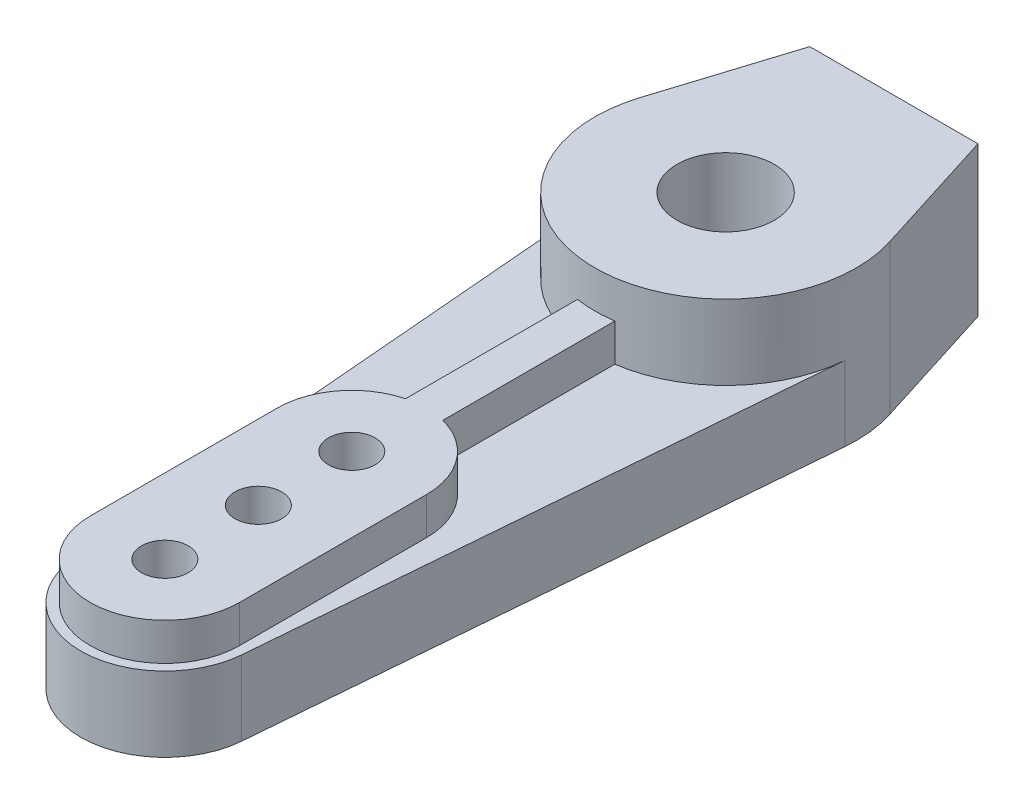
ISO-10303-21;
HEADER;
FILE_DESCRIPTION(('STEP AP214'),'2;1');
FILE_NAME('part.step','',(''),(''),'','','');
FILE_SCHEMA(('AUTOMOTIVE_DESIGN { 1 0 10303 214 1 1 1 1 }'));
ENDSEC;
DATA;
#1=APPLICATION_CONTEXT('core data for automotive mechanical design processes');
#2=APPLICATION_PROTOCOL_DEFINITION('international standard','automotive_design',2000,#1);
#3=PRODUCT_CONTEXT('',#1,'mechanical');
#4=PRODUCT('Part','Part','',(#3));
#5=PRODUCT_RELATED_PRODUCT_CATEGORY('part','',(#4));
#6=PRODUCT_DEFINITION_FORMATION('','',#4);
#7=PRODUCT_DEFINITION_CONTEXT('part definition',#1,'design');
#8=PRODUCT_DEFINITION('design','',#6,#7);
#9=PRODUCT_DEFINITION_SHAPE('','',#8);
#10=(LENGTH_UNIT() NAMED_UNIT(*) SI_UNIT(.MILLI.,.METRE.));
#11=(NAMED_UNIT(*) PLANE_ANGLE_UNIT() SI_UNIT($,.RADIAN.));
#12=(NAMED_UNIT(*) SI_UNIT($,.STERADIAN.) SOLID_ANGLE_UNIT());
#13=UNCERTAINTY_MEASURE_WITH_UNIT(LENGTH_MEASURE(1.E-05),#10,'distance_accuracy_value','');
#14=(GEOMETRIC_REPRESENTATION_CONTEXT(3) GLOBAL_UNCERTAINTY_ASSIGNED_CONTEXT((#13)) GLOBAL_UNIT_ASSIGNED_CONTEXT((#10,
#11,#12)) REPRESENTATION_CONTEXT('',''));
#15=CARTESIAN_POINT('',(0.,0.,0.));
#16=DIRECTION('',(0.,0.,1.));
#17=DIRECTION('',(1.,0.,0.));
#18=AXIS2_PLACEMENT_3D('',#15,#16,#17);
#19=CARTESIAN_POINT('',(0.,4.,0.));
#20=DIRECTION('',(0.,-1.,0.));
#21=DIRECTION('',(0.,0.,-1.));
#22=AXIS2_PLACEMENT_3D('',#19,#20,#21);
#23=CYLINDRICAL_SURFACE('',#22,7.);
#24=DIRECTION('',(0.,-1.,0.));
#25=VECTOR('',#24,1.);
#26=CARTESIAN_POINT('',(0.999999999999997,6.,6.92820323027551));
#27=LINE('',#26,#25);
#28=CARTESIAN_POINT('',(0.999999999999997,6.,6.92820323027551));
#29=VERTEX_POINT('',#28);
#30=CARTESIAN_POINT('',(0.999999999999997,4.,6.92820323027551));
#31=VERTEX_POINT('',#30);
#32=EDGE_CURVE('E164',#29,#31,#27,.T.);
#33=ORIENTED_EDGE('',*,*,#32,.T.);
#34=CARTESIAN_POINT('',(0.,4.,0.));
#35=DIRECTION('',(0.,1.,0.));
#36=DIRECTION('',(0.,0.,1.));
#37=AXIS2_PLACEMENT_3D('',#34,#35,#36);
#38=CIRCLE('',#37,7.);
#39=CARTESIAN_POINT('',(6.97565210014248,4.,0.583333333333333));
#40=VERTEX_POINT('',#39);
#41=EDGE_CURVE('E45',#31,#40,#38,.T.);
#42=ORIENTED_EDGE('',*,*,#41,.T.);
#43=DIRECTION('',(0.,-1.,0.));
#44=VECTOR('',#43,1.);
#45=CARTESIAN_POINT('',(6.97565210014248,4.,0.583333333333333));
#46=LINE('',#45,#44);
#47=CARTESIAN_POINT('',(6.97565210014248,0.,0.583333333333333));
#48=VERTEX_POINT('',#47);
#49=EDGE_CURVE('E244',#40,#48,#46,.T.);
#50=ORIENTED_EDGE('',*,*,#49,.T.);
#51=CARTESIAN_POINT('',(0.,0.,0.));
#52=DIRECTION('',(0.,1.,0.));
#53=DIRECTION('',(0.,0.,1.));
#54=AXIS2_PLACEMENT_3D('',#51,#52,#53);
#55=CIRCLE('',#54,7.);
#56=CARTESIAN_POINT('',(6.6754589361603,0.,-2.10671497636429));
#57=VERTEX_POINT('',#56);
#58=EDGE_CURVE('E217',#48,#57,#55,.T.);
#59=ORIENTED_EDGE('',*,*,#58,.T.);
#60=DIRECTION('',(0.,-1.,0.));
#61=VECTOR('',#60,1.);
#62=CARTESIAN_POINT('',(6.6754589361603,4.,-2.10671497636429));
#63=LINE('',#62,#61);
#64=CARTESIAN_POINT('',(6.6754589361603,8.,-2.10671497636429));
#65=VERTEX_POINT('',#64);
#66=EDGE_CURVE('E242',#65,#57,#63,.T.);
#67=ORIENTED_EDGE('',*,*,#66,.F.);
#68=CARTESIAN_POINT('',(0.,8.,0.));
#69=DIRECTION('',(0.,1.,0.));
#70=DIRECTION('',(0.,0.,1.));
#71=AXIS2_PLACEMENT_3D('',#68,#69,#70);
#72=CIRCLE('',#71,7.);
#73=CARTESIAN_POINT('',(-6.6754589361603,8.,-2.10671497636429));
#74=VERTEX_POINT('',#73);
#75=EDGE_CURVE('E184',#74,#65,#72,.T.);
#76=ORIENTED_EDGE('',*,*,#75,.F.);
#77=DIRECTION('',(0.,-1.,0.));
#78=VECTOR('',#77,1.);
#79=CARTESIAN_POINT('',(-6.6754589361603,4.,-2.10671497636429));
#80=LINE('',#79,#78);
#81=CARTESIAN_POINT('',(-6.6754589361603,0.,-2.10671497636429));
#82=VERTEX_POINT('',#81);
#83=EDGE_CURVE('E210',#74,#82,#80,.T.);
#84=ORIENTED_EDGE('',*,*,#83,.T.);
#85=CARTESIAN_POINT('',(-6.97565210014248,0.,0.583333333333333));
#86=VERTEX_POINT('',#85);
#87=EDGE_CURVE('E213',#82,#86,#55,.T.);
#88=ORIENTED_EDGE('',*,*,#87,.T.);
#89=DIRECTION('',(0.,-1.,0.));
#90=VECTOR('',#89,1.);
#91=CARTESIAN_POINT('',(-6.97565210014248,4.,0.583333333333333));
#92=LINE('',#91,#90);
#93=CARTESIAN_POINT('',(-6.97565210014248,4.,0.583333333333333));
#94=VERTEX_POINT('',#93);
#95=EDGE_CURVE('E250',#94,#86,#92,.T.);
#96=ORIENTED_EDGE('',*,*,#95,.F.);
#97=CARTESIAN_POINT('',(-1.,4.,6.92820323027551));
#98=VERTEX_POINT('',#97);
#99=EDGE_CURVE('E11',#94,#98,#38,.T.);
#100=ORIENTED_EDGE('',*,*,#99,.T.);
#101=DIRECTION('',(0.,-1.,0.));
#102=VECTOR('',#101,1.);
#103=CARTESIAN_POINT('',(-1.,6.,6.92820323027551));
#104=LINE('',#103,#102);
#105=CARTESIAN_POINT('',(-1.,6.,6.92820323027551));
#106=VERTEX_POINT('',#105);
#107=EDGE_CURVE('E189',#106,#98,#104,.T.);
#108=ORIENTED_EDGE('',*,*,#107,.F.);
#109=CARTESIAN_POINT('',(0.,6.,0.));
#110=DIRECTION('',(0.,1.,0.));
#111=DIRECTION('',(0.,0.,1.));
#112=AXIS2_PLACEMENT_3D('',#109,#110,#111);
#113=CIRCLE('',#112,7.);
#114=EDGE_CURVE('E167',#29,#106,#113,.F.);
#115=ORIENTED_EDGE('',*,*,#114,.F.);
#116=EDGE_LOOP('',(#33,#42,#50,#59,#67,#76,#84,#88,#96,#100,#108,#115));
#117=FACE_BOUND('',#116,.T.);
#118=ADVANCED_FACE('F36',(#117),#23,.T.);
#119=CARTESIAN_POINT('',(0.,4.,0.));
#120=DIRECTION('',(0.,1.,0.));
#121=DIRECTION('',(0.,0.,1.));
#122=AXIS2_PLACEMENT_3D('',#119,#120,#121);
#123=PLANE('',#122);
#124=ORIENTED_EDGE('',*,*,#41,.F.);
#125=DIRECTION('',(0.,0.,-1.));
#126=VECTOR('',#125,1.);
#127=CARTESIAN_POINT('',(0.999999999999996,4.,0.));
#128=LINE('',#127,#126);
#129=CARTESIAN_POINT('',(0.999999999999998,4.,16.1270166537926));
#130=VERTEX_POINT('',#129);
#131=EDGE_CURVE('E538',#130,#31,#128,.T.);
#132=ORIENTED_EDGE('',*,*,#131,.F.);
#133=CARTESIAN_POINT('',(0.,4.,20.));
#134=DIRECTION('',(0.,1.,0.));
#135=DIRECTION('',(0.,0.,1.));
#136=AXIS2_PLACEMENT_3D('',#133,#134,#135);
#137=CIRCLE('',#136,4.);
#138=CARTESIAN_POINT('',(4.,4.,20.));
#139=VERTEX_POINT('',#138);
#140=EDGE_CURVE('E182',#139,#130,#137,.T.);
#141=ORIENTED_EDGE('',*,*,#140,.F.);
#142=DIRECTION('',(0.,0.,-1.));
#143=VECTOR('',#142,1.);
#144=CARTESIAN_POINT('',(4.,4.,0.));
#145=LINE('',#144,#143);
#146=CARTESIAN_POINT('',(4.,4.,30.));
#147=VERTEX_POINT('',#146);
#148=EDGE_CURVE('E177',#147,#139,#145,.T.);
#149=ORIENTED_EDGE('',*,*,#148,.F.);
#150=CARTESIAN_POINT('',(0.,4.,30.));
#151=DIRECTION('',(0.,1.,0.));
#152=DIRECTION('',(0.,0.,1.));
#153=AXIS2_PLACEMENT_3D('',#150,#151,#152);
#154=CIRCLE('',#153,4.);
#155=CARTESIAN_POINT('',(-4.,4.,30.));
#156=VERTEX_POINT('',#155);
#157=EDGE_CURVE('E546',#156,#147,#154,.T.);
#158=ORIENTED_EDGE('',*,*,#157,.F.);
#159=DIRECTION('',(0.,0.,-1.));
#160=VECTOR('',#159,1.);
#161=CARTESIAN_POINT('',(-4.,4.,0.));
#162=LINE('',#161,#160);
#163=CARTESIAN_POINT('',(-4.,4.,20.));
#164=VERTEX_POINT('',#163);
#165=EDGE_CURVE('E543',#156,#164,#162,.T.);
#166=ORIENTED_EDGE('',*,*,#165,.T.);
#167=CARTESIAN_POINT('',(-1.,4.,16.1270166537926));
#168=VERTEX_POINT('',#167);
#169=EDGE_CURVE('E539',#168,#164,#137,.T.);
#170=ORIENTED_EDGE('',*,*,#169,.F.);
#171=DIRECTION('',(0.,0.,-1.));
#172=VECTOR('',#171,1.);
#173=CARTESIAN_POINT('',(-1.00000000000001,4.,0.));
#174=LINE('',#173,#172);
#175=EDGE_CURVE('E541',#168,#98,#174,.T.);
#176=ORIENTED_EDGE('',*,*,#175,.T.);
#177=ORIENTED_EDGE('',*,*,#99,.F.);
#178=DIRECTION('',(0.0833333333333332,0.,0.996521728591783));
#179=VECTOR('',#178,1.);
#180=CARTESIAN_POINT('',(-6.97565210014248,4.,0.583333333333332));
#181=LINE('',#180,#179);
#182=CARTESIAN_POINT('',(-4.48434777866302,4.,30.375));
#183=VERTEX_POINT('',#182);
#184=EDGE_CURVE('E202',#94,#183,#181,.T.);
#185=ORIENTED_EDGE('',*,*,#184,.T.);
#186=CARTESIAN_POINT('',(0.,4.,30.));
#187=DIRECTION('',(0.,1.,0.));
#188=DIRECTION('',(0.,0.,1.));
#189=AXIS2_PLACEMENT_3D('',#186,#187,#188);
#190=CIRCLE('',#189,4.5);
#191=CARTESIAN_POINT('',(4.48434777866302,4.,30.375));
#192=VERTEX_POINT('',#191);
#193=EDGE_CURVE('E204',#183,#192,#190,.T.);
#194=ORIENTED_EDGE('',*,*,#193,.T.);
#195=DIRECTION('',(-0.0833333333333332,0.,0.996521728591783));
#196=VECTOR('',#195,1.);
#197=CARTESIAN_POINT('',(6.97565210014248,4.,0.583333333333332));
#198=LINE('',#197,#196);
#199=EDGE_CURVE('E207',#40,#192,#198,.T.);
#200=ORIENTED_EDGE('',*,*,#199,.F.);
#201=EDGE_LOOP('',(#124,#132,#141,#149,#158,#166,#170,#176,#177,#185,#194,#200));
#202=FACE_BOUND('',#201,.T.);
#203=ADVANCED_FACE('F270',(#202),#123,.T.);
#204=CARTESIAN_POINT('',(-6.97565210014248,4.,0.583333333333332));
#205=DIRECTION('',(0.996521728591783,0.,-0.0833333333333332));
#206=DIRECTION('',(-0.0833333333333332,0.,-0.996521728591783));
#207=AXIS2_PLACEMENT_3D('',#204,#205,#206);
#208=PLANE('',#207);
#209=DIRECTION('',(0.0833333333333332,0.,0.996521728591783));
#210=VECTOR('',#209,1.);
#211=CARTESIAN_POINT('',(-6.97565210014248,0.,0.583333333333332));
#212=LINE('',#211,#210);
#213=CARTESIAN_POINT('',(-4.48434777866302,0.,30.375));
#214=VERTEX_POINT('',#213);
#215=EDGE_CURVE('E216',#86,#214,#212,.T.);
#216=ORIENTED_EDGE('',*,*,#215,.T.);
#217=DIRECTION('',(0.,-1.,0.));
#218=VECTOR('',#217,1.);
#219=CARTESIAN_POINT('',(-4.48434777866302,4.,30.375));
#220=LINE('',#219,#218);
#221=EDGE_CURVE('E248',#183,#214,#220,.T.);
#222=ORIENTED_EDGE('',*,*,#221,.F.);
#223=ORIENTED_EDGE('',*,*,#184,.F.);
#224=ORIENTED_EDGE('',*,*,#95,.T.);
#225=EDGE_LOOP('',(#216,#222,#223,#224));
#226=FACE_BOUND('',#225,.T.);
#227=ADVANCED_FACE('F254',(#226),#208,.F.);
#228=CARTESIAN_POINT('',(0.,4.,30.));
#229=DIRECTION('',(0.,-1.,0.));
#230=DIRECTION('',(0.,0.,-1.));
#231=AXIS2_PLACEMENT_3D('',#228,#229,#230);
#232=CYLINDRICAL_SURFACE('',#231,4.5);
#233=CARTESIAN_POINT('',(0.,0.,30.));
#234=DIRECTION('',(0.,1.,0.));
#235=DIRECTION('',(0.,0.,1.));
#236=AXIS2_PLACEMENT_3D('',#233,#234,#235);
#237=CIRCLE('',#236,4.5);
#238=CARTESIAN_POINT('',(4.48434777866302,0.,30.375));
#239=VERTEX_POINT('',#238);
#240=EDGE_CURVE('E219',#214,#239,#237,.T.);
#241=ORIENTED_EDGE('',*,*,#240,.T.);
#242=DIRECTION('',(0.,-1.,0.));
#243=VECTOR('',#242,1.);
#244=CARTESIAN_POINT('',(4.48434777866302,4.,30.375));
#245=LINE('',#244,#243);
#246=EDGE_CURVE('E246',#192,#239,#245,.T.);
#247=ORIENTED_EDGE('',*,*,#246,.F.);
#248=ORIENTED_EDGE('',*,*,#193,.F.);
#249=ORIENTED_EDGE('',*,*,#221,.T.);
#250=EDGE_LOOP('',(#241,#247,#248,#249));
#251=FACE_BOUND('',#250,.T.);
#252=ADVANCED_FACE('F267',(#251),#232,.T.);
#253=CARTESIAN_POINT('',(6.97565210014248,4.,0.583333333333332));
#254=DIRECTION('',(0.996521728591783,0.,0.0833333333333332));
#255=DIRECTION('',(0.0833333333333332,0.,-0.996521728591783));
#256=AXIS2_PLACEMENT_3D('',#253,#254,#255);
#257=PLANE('',#256);
#258=DIRECTION('',(-0.0833333333333332,0.,0.996521728591783));
#259=VECTOR('',#258,1.);
#260=CARTESIAN_POINT('',(6.97565210014248,0.,0.583333333333332));
#261=LINE('',#260,#259);
#262=EDGE_CURVE('E222',#48,#239,#261,.T.);
#263=ORIENTED_EDGE('',*,*,#262,.F.);
#264=ORIENTED_EDGE('',*,*,#49,.F.);
#265=ORIENTED_EDGE('',*,*,#199,.T.);
#266=ORIENTED_EDGE('',*,*,#246,.T.);
#267=EDGE_LOOP('',(#263,#264,#265,#266));
#268=FACE_BOUND('',#267,.T.);
#269=ADVANCED_FACE('F272',(#268),#257,.T.);
#270=CARTESIAN_POINT('',(6.6754589361603,4.,-2.10671497636429));
#271=DIRECTION('',(0.953636990880043,0.,-0.300959282337756));
#272=DIRECTION('',(-0.300959282337756,0.,-0.953636990880043));
#273=AXIS2_PLACEMENT_3D('',#270,#271,#272);
#274=PLANE('',#273);
#275=DIRECTION('',(0.300959282337756,0.,0.953636990880043));
#276=VECTOR('',#275,1.);
#277=CARTESIAN_POINT('',(6.6754589361603,0.,-2.10671497636429));
#278=LINE('',#277,#276);
#279=CARTESIAN_POINT('',(4.5,0.,-9.));
#280=VERTEX_POINT('',#279);
#281=EDGE_CURVE('E225',#280,#57,#278,.T.);
#282=ORIENTED_EDGE('',*,*,#281,.F.);
#283=DIRECTION('',(0.,-1.,0.));
#284=VECTOR('',#283,1.);
#285=CARTESIAN_POINT('',(4.5,4.,-9.));
#286=LINE('',#285,#284);
#287=CARTESIAN_POINT('',(4.5,8.,-9.));
#288=VERTEX_POINT('',#287);
#289=EDGE_CURVE('E240',#288,#280,#286,.T.);
#290=ORIENTED_EDGE('',*,*,#289,.F.);
#291=DIRECTION('',(-0.300959282337756,0.,-0.953636990880043));
#292=VECTOR('',#291,1.);
#293=CARTESIAN_POINT('',(6.6754589361603,8.,-2.10671497636429));
#294=LINE('',#293,#292);
#295=EDGE_CURVE('E187',#65,#288,#294,.T.);
#296=ORIENTED_EDGE('',*,*,#295,.F.);
#297=ORIENTED_EDGE('',*,*,#66,.T.);
#298=EDGE_LOOP('',(#282,#290,#296,#297));
#299=FACE_BOUND('',#298,.T.);
#300=ADVANCED_FACE('F276',(#299),#274,.T.);
#301=CARTESIAN_POINT('',(0.,4.,-9.));
#302=DIRECTION('',(0.,0.,-1.));
#303=DIRECTION('',(-1.,0.,0.));
#304=AXIS2_PLACEMENT_3D('',#301,#302,#303);
#305=PLANE('',#304);
#306=DIRECTION('',(1.,0.,0.));
#307=VECTOR('',#306,1.);
#308=CARTESIAN_POINT('',(0.,0.,-9.));
#309=LINE('',#308,#307);
#310=CARTESIAN_POINT('',(-4.5,0.,-9.));
#311=VERTEX_POINT('',#310);
#312=EDGE_CURVE('E228',#311,#280,#309,.T.);
#313=ORIENTED_EDGE('',*,*,#312,.F.);
#314=DIRECTION('',(0.,-1.,0.));
#315=VECTOR('',#314,1.);
#316=CARTESIAN_POINT('',(-4.5,4.,-9.));
#317=LINE('',#316,#315);
#318=CARTESIAN_POINT('',(-4.5,8.,-9.));
#319=VERTEX_POINT('',#318);
#320=EDGE_CURVE('E238',#319,#311,#317,.T.);
#321=ORIENTED_EDGE('',*,*,#320,.F.);
#322=DIRECTION('',(-1.,0.,0.));
#323=VECTOR('',#322,1.);
#324=CARTESIAN_POINT('',(0.,8.,-9.));
#325=LINE('',#324,#323);
#326=EDGE_CURVE('E195',#288,#319,#325,.T.);
#327=ORIENTED_EDGE('',*,*,#326,.F.);
#328=ORIENTED_EDGE('',*,*,#289,.T.);
#329=EDGE_LOOP('',(#313,#321,#327,#328));
#330=FACE_BOUND('',#329,.T.);
#331=ADVANCED_FACE('F284',(#330),#305,.T.);
#332=CARTESIAN_POINT('',(0.,4.,20.));
#333=DIRECTION('',(0.,-1.,0.));
#334=DIRECTION('',(0.,0.,-1.));
#335=AXIS2_PLACEMENT_3D('',#332,#333,#334);
#336=CYLINDRICAL_SURFACE('',#335,1.25);
#337=CARTESIAN_POINT('',(0.,0.,20.));
#338=DIRECTION('',(0.,1.,0.));
#339=DIRECTION('',(0.,0.,1.));
#340=AXIS2_PLACEMENT_3D('',#337,#338,#339);
#341=CIRCLE('',#340,1.25);
#342=CARTESIAN_POINT('',(0.,0.,21.25));
#343=VERTEX_POINT('',#342);
#344=EDGE_CURVE('E232',#343,#343,#341,.T.);
#345=ORIENTED_EDGE('',*,*,#344,.F.);
#346=EDGE_LOOP('',(#345));
#347=FACE_BOUND('',#346,.T.);
#348=CARTESIAN_POINT('',(0.,6.,20.));
#349=DIRECTION('',(0.,1.,0.));
#350=DIRECTION('',(0.,0.,1.));
#351=AXIS2_PLACEMENT_3D('',#348,#349,#350);
#352=CIRCLE('',#351,1.25);
#353=CARTESIAN_POINT('',(0.,6.,21.25));
#354=VERTEX_POINT('',#353);
#355=EDGE_CURVE('E533',#354,#354,#352,.F.);
#356=ORIENTED_EDGE('',*,*,#355,.F.);
#357=EDGE_LOOP('',(#356));
#358=FACE_BOUND('',#357,.T.);
#359=ADVANCED_FACE('F286',(#347,#358),#336,.F.);
#360=CARTESIAN_POINT('',(-6.6754589361603,4.,-2.10671497636429));
#361=DIRECTION('',(0.953636990880043,0.,0.300959282337756));
#362=DIRECTION('',(0.300959282337756,0.,-0.953636990880043));
#363=AXIS2_PLACEMENT_3D('',#360,#361,#362);
#364=PLANE('',#363);
#365=DIRECTION('',(-0.300959282337756,0.,0.953636990880043));
#366=VECTOR('',#365,1.);
#367=CARTESIAN_POINT('',(-6.6754589361603,0.,-2.10671497636429));
#368=LINE('',#367,#366);
#369=EDGE_CURVE('E94',#311,#82,#368,.T.);
#370=ORIENTED_EDGE('',*,*,#369,.T.);
#371=ORIENTED_EDGE('',*,*,#83,.F.);
#372=DIRECTION('',(-0.300959282337756,0.,0.953636990880043));
#373=VECTOR('',#372,1.);
#374=CARTESIAN_POINT('',(-6.6754589361603,8.,-2.10671497636429));
#375=LINE('',#374,#373);
#376=EDGE_CURVE('E198',#319,#74,#375,.T.);
#377=ORIENTED_EDGE('',*,*,#376,.F.);
#378=ORIENTED_EDGE('',*,*,#320,.T.);
#379=EDGE_LOOP('',(#370,#371,#377,#378));
#380=FACE_BOUND('',#379,.T.);
#381=ADVANCED_FACE('F282',(#380),#364,.F.);
#382=CARTESIAN_POINT('',(0.,4.,25.));
#383=DIRECTION('',(0.,-1.,0.));
#384=DIRECTION('',(0.,0.,-1.));
#385=AXIS2_PLACEMENT_3D('',#382,#383,#384);
#386=CYLINDRICAL_SURFACE('',#385,1.25);
#387=CARTESIAN_POINT('',(0.,0.,25.));
#388=DIRECTION('',(0.,1.,0.));
#389=DIRECTION('',(0.,0.,1.));
#390=AXIS2_PLACEMENT_3D('',#387,#388,#389);
#391=CIRCLE('',#390,1.25);
#392=CARTESIAN_POINT('',(0.,0.,26.25));
#393=VERTEX_POINT('',#392);
#394=EDGE_CURVE('E200',#393,#393,#391,.T.);
#395=ORIENTED_EDGE('',*,*,#394,.F.);
#396=EDGE_LOOP('',(#395));
#397=FACE_BOUND('',#396,.T.);
#398=CARTESIAN_POINT('',(0.,6.,25.));
#399=DIRECTION('',(0.,1.,0.));
#400=DIRECTION('',(0.,0.,1.));
#401=AXIS2_PLACEMENT_3D('',#398,#399,#400);
#402=CIRCLE('',#401,1.25);
#403=CARTESIAN_POINT('',(0.,6.,26.25));
#404=VERTEX_POINT('',#403);
#405=EDGE_CURVE('E527',#404,#404,#402,.F.);
#406=ORIENTED_EDGE('',*,*,#405,.F.);
#407=EDGE_LOOP('',(#406));
#408=FACE_BOUND('',#407,.T.);
#409=ADVANCED_FACE('F38',(#397,#408),#386,.F.);
#410=CARTESIAN_POINT('',(0.,4.,30.));
#411=DIRECTION('',(0.,-1.,0.));
#412=DIRECTION('',(0.,0.,-1.));
#413=AXIS2_PLACEMENT_3D('',#410,#411,#412);
#414=CYLINDRICAL_SURFACE('',#413,1.25);
#415=CARTESIAN_POINT('',(0.,0.,30.));
#416=DIRECTION('',(0.,1.,0.));
#417=DIRECTION('',(0.,0.,1.));
#418=AXIS2_PLACEMENT_3D('',#415,#416,#417);
#419=CIRCLE('',#418,1.25);
#420=CARTESIAN_POINT('',(0.,0.,31.25));
#421=VERTEX_POINT('',#420);
#422=EDGE_CURVE('E205',#421,#421,#419,.T.);
#423=ORIENTED_EDGE('',*,*,#422,.F.);
#424=EDGE_LOOP('',(#423));
#425=FACE_BOUND('',#424,.T.);
#426=CARTESIAN_POINT('',(0.,6.,30.));
#427=DIRECTION('',(0.,1.,0.));
#428=DIRECTION('',(0.,0.,1.));
#429=AXIS2_PLACEMENT_3D('',#426,#427,#428);
#430=CIRCLE('',#429,1.25);
#431=CARTESIAN_POINT('',(0.,6.,31.25));
#432=VERTEX_POINT('',#431);
#433=EDGE_CURVE('E530',#432,#432,#430,.F.);
#434=ORIENTED_EDGE('',*,*,#433,.F.);
#435=EDGE_LOOP('',(#434));
#436=FACE_BOUND('',#435,.T.);
#437=ADVANCED_FACE('F365',(#425,#436),#414,.F.);
#438=CARTESIAN_POINT('',(0.,0.,0.));
#439=DIRECTION('',(0.,1.,0.));
#440=DIRECTION('',(0.,0.,1.));
#441=AXIS2_PLACEMENT_3D('',#438,#439,#440);
#442=PLANE('',#441);
#443=CARTESIAN_POINT('',(0.,0.,0.));
#444=DIRECTION('',(0.,-1.,0.));
#445=DIRECTION('',(0.,0.,-1.));
#446=AXIS2_PLACEMENT_3D('',#443,#444,#445);
#447=CIRCLE('',#446,1.5);
#448=CARTESIAN_POINT('',(0.,0.,-1.5));
#449=VERTEX_POINT('',#448);
#450=EDGE_CURVE('E508',#449,#449,#447,.T.);
#451=ORIENTED_EDGE('',*,*,#450,.F.);
#452=EDGE_LOOP('',(#451));
#453=FACE_BOUND('',#452,.T.);
#454=ORIENTED_EDGE('',*,*,#394,.T.);
#455=EDGE_LOOP('',(#454));
#456=FACE_BOUND('',#455,.T.);
#457=ORIENTED_EDGE('',*,*,#87,.F.);
#458=ORIENTED_EDGE('',*,*,#369,.F.);
#459=ORIENTED_EDGE('',*,*,#312,.T.);
#460=ORIENTED_EDGE('',*,*,#281,.T.);
#461=ORIENTED_EDGE('',*,*,#58,.F.);
#462=ORIENTED_EDGE('',*,*,#262,.T.);
#463=ORIENTED_EDGE('',*,*,#240,.F.);
#464=ORIENTED_EDGE('',*,*,#215,.F.);
#465=EDGE_LOOP('',(#457,#458,#459,#460,#461,#462,#463,#464));
#466=FACE_BOUND('',#465,.T.);
#467=ORIENTED_EDGE('',*,*,#344,.T.);
#468=EDGE_LOOP('',(#467));
#469=FACE_BOUND('',#468,.T.);
#470=ORIENTED_EDGE('',*,*,#422,.T.);
#471=EDGE_LOOP('',(#470));
#472=FACE_BOUND('',#471,.T.);
#473=ADVANCED_FACE('F259',(#453,#456,#466,#469,#472),#442,.F.);
#474=CARTESIAN_POINT('',(0.,8.,0.));
#475=DIRECTION('',(0.,1.,0.));
#476=DIRECTION('',(0.,0.,1.));
#477=AXIS2_PLACEMENT_3D('',#474,#475,#476);
#478=PLANE('',#477);
#479=CARTESIAN_POINT('',(0.,8.,0.));
#480=DIRECTION('',(0.,1.,0.));
#481=DIRECTION('',(0.,0.,1.));
#482=AXIS2_PLACEMENT_3D('',#479,#480,#481);
#483=CIRCLE('',#482,2.6);
#484=CARTESIAN_POINT('',(0.,8.,2.6));
#485=VERTEX_POINT('',#484);
#486=EDGE_CURVE('E510',#485,#485,#483,.T.);
#487=ORIENTED_EDGE('',*,*,#486,.F.);
#488=EDGE_LOOP('',(#487));
#489=FACE_BOUND('',#488,.T.);
#490=ORIENTED_EDGE('',*,*,#75,.T.);
#491=ORIENTED_EDGE('',*,*,#295,.T.);
#492=ORIENTED_EDGE('',*,*,#326,.T.);
#493=ORIENTED_EDGE('',*,*,#376,.T.);
#494=EDGE_LOOP('',(#490,#491,#492,#493));
#495=FACE_BOUND('',#494,.T.);
#496=ADVANCED_FACE('F279',(#489,#495),#478,.T.);
#497=CARTESIAN_POINT('',(0.,6.,20.));
#498=DIRECTION('',(0.,-1.,0.));
#499=DIRECTION('',(0.,0.,-1.));
#500=AXIS2_PLACEMENT_3D('',#497,#498,#499);
#501=CYLINDRICAL_SURFACE('',#500,4.);
#502=ORIENTED_EDGE('',*,*,#140,.T.);
#503=DIRECTION('',(0.,-1.,0.));
#504=VECTOR('',#503,1.);
#505=CARTESIAN_POINT('',(0.999999999999998,6.,16.1270166537926));
#506=LINE('',#505,#504);
#507=CARTESIAN_POINT('',(0.999999999999998,6.,16.1270166537926));
#508=VERTEX_POINT('',#507);
#509=EDGE_CURVE('E162',#508,#130,#506,.T.);
#510=ORIENTED_EDGE('',*,*,#509,.F.);
#511=CARTESIAN_POINT('',(0.,6.,20.));
#512=DIRECTION('',(0.,1.,0.));
#513=DIRECTION('',(0.,0.,1.));
#514=AXIS2_PLACEMENT_3D('',#511,#512,#513);
#515=CIRCLE('',#514,4.);
#516=CARTESIAN_POINT('',(4.,6.,20.));
#517=VERTEX_POINT('',#516);
#518=EDGE_CURVE('E168',#517,#508,#515,.T.);
#519=ORIENTED_EDGE('',*,*,#518,.F.);
#520=DIRECTION('',(0.,-1.,0.));
#521=VECTOR('',#520,1.);
#522=CARTESIAN_POINT('',(4.,6.,20.));
#523=LINE('',#522,#521);
#524=EDGE_CURVE('E536',#517,#139,#523,.T.);
#525=ORIENTED_EDGE('',*,*,#524,.T.);
#526=EDGE_LOOP('',(#502,#510,#519,#525));
#527=FACE_BOUND('',#526,.T.);
#528=ADVANCED_FACE('F180',(#527),#501,.T.);
#529=CARTESIAN_POINT('',(0.999999999999996,6.,0.));
#530=DIRECTION('',(-1.,0.,0.));
#531=DIRECTION('',(0.,0.,1.));
#532=AXIS2_PLACEMENT_3D('',#529,#530,#531);
#533=PLANE('',#532);
#534=ORIENTED_EDGE('',*,*,#131,.T.);
#535=ORIENTED_EDGE('',*,*,#32,.F.);
#536=DIRECTION('',(0.,0.,-1.));
#537=VECTOR('',#536,1.);
#538=CARTESIAN_POINT('',(0.999999999999996,6.,0.));
#539=LINE('',#538,#537);
#540=EDGE_CURVE('E158',#508,#29,#539,.T.);
#541=ORIENTED_EDGE('',*,*,#540,.F.);
#542=ORIENTED_EDGE('',*,*,#509,.T.);
#543=EDGE_LOOP('',(#534,#535,#541,#542));
#544=FACE_BOUND('',#543,.T.);
#545=ADVANCED_FACE('F160',(#544),#533,.F.);
#546=CARTESIAN_POINT('',(-1.00000000000001,6.,0.));
#547=DIRECTION('',(-1.,0.,0.));
#548=DIRECTION('',(0.,0.,1.));
#549=AXIS2_PLACEMENT_3D('',#546,#547,#548);
#550=PLANE('',#549);
#551=ORIENTED_EDGE('',*,*,#175,.F.);
#552=DIRECTION('',(0.,-1.,0.));
#553=VECTOR('',#552,1.);
#554=CARTESIAN_POINT('',(-1.,6.,16.1270166537926));
#555=LINE('',#554,#553);
#556=CARTESIAN_POINT('',(-1.,6.,16.1270166537926));
#557=VERTEX_POINT('',#556);
#558=EDGE_CURVE('E555',#557,#168,#555,.T.);
#559=ORIENTED_EDGE('',*,*,#558,.F.);
#560=DIRECTION('',(0.,0.,-1.));
#561=VECTOR('',#560,1.);
#562=CARTESIAN_POINT('',(-1.00000000000001,6.,0.));
#563=LINE('',#562,#561);
#564=EDGE_CURVE('E518',#557,#106,#563,.T.);
#565=ORIENTED_EDGE('',*,*,#564,.T.);
#566=ORIENTED_EDGE('',*,*,#107,.T.);
#567=EDGE_LOOP('',(#551,#559,#565,#566));
#568=FACE_BOUND('',#567,.T.);
#569=ADVANCED_FACE('F396',(#568),#550,.T.);
#570=ORIENTED_EDGE('',*,*,#169,.T.);
#571=DIRECTION('',(0.,-1.,0.));
#572=VECTOR('',#571,1.);
#573=CARTESIAN_POINT('',(-4.,6.,20.));
#574=LINE('',#573,#572);
#575=CARTESIAN_POINT('',(-4.,6.,20.));
#576=VERTEX_POINT('',#575);
#577=EDGE_CURVE('E553',#576,#164,#574,.T.);
#578=ORIENTED_EDGE('',*,*,#577,.F.);
#579=EDGE_CURVE('E179',#557,#576,#515,.T.);
#580=ORIENTED_EDGE('',*,*,#579,.F.);
#581=ORIENTED_EDGE('',*,*,#558,.T.);
#582=EDGE_LOOP('',(#570,#578,#580,#581));
#583=FACE_BOUND('',#582,.T.);
#584=ADVANCED_FACE('F387',(#583),#501,.T.);
#585=CARTESIAN_POINT('',(-4.,6.,0.));
#586=DIRECTION('',(-1.,0.,0.));
#587=DIRECTION('',(0.,0.,1.));
#588=AXIS2_PLACEMENT_3D('',#585,#586,#587);
#589=PLANE('',#588);
#590=ORIENTED_EDGE('',*,*,#165,.F.);
#591=DIRECTION('',(0.,-1.,0.));
#592=VECTOR('',#591,1.);
#593=CARTESIAN_POINT('',(-4.,6.,30.));
#594=LINE('',#593,#592);
#595=CARTESIAN_POINT('',(-4.,6.,30.));
#596=VERTEX_POINT('',#595);
#597=EDGE_CURVE('E551',#596,#156,#594,.T.);
#598=ORIENTED_EDGE('',*,*,#597,.F.);
#599=DIRECTION('',(0.,0.,-1.));
#600=VECTOR('',#599,1.);
#601=CARTESIAN_POINT('',(-4.,6.,0.));
#602=LINE('',#601,#600);
#603=EDGE_CURVE('E521',#596,#576,#602,.T.);
#604=ORIENTED_EDGE('',*,*,#603,.T.);
#605=ORIENTED_EDGE('',*,*,#577,.T.);
#606=EDGE_LOOP('',(#590,#598,#604,#605));
#607=FACE_BOUND('',#606,.T.);
#608=ADVANCED_FACE('F414',(#607),#589,.T.);
#609=CARTESIAN_POINT('',(0.,6.,30.));
#610=DIRECTION('',(0.,-1.,0.));
#611=DIRECTION('',(0.,0.,-1.));
#612=AXIS2_PLACEMENT_3D('',#609,#610,#611);
#613=CYLINDRICAL_SURFACE('',#612,4.);
#614=ORIENTED_EDGE('',*,*,#157,.T.);
#615=DIRECTION('',(0.,-1.,0.));
#616=VECTOR('',#615,1.);
#617=CARTESIAN_POINT('',(4.,6.,30.));
#618=LINE('',#617,#616);
#619=CARTESIAN_POINT('',(4.,6.,30.));
#620=VERTEX_POINT('',#619);
#621=EDGE_CURVE('E53',#620,#147,#618,.T.);
#622=ORIENTED_EDGE('',*,*,#621,.F.);
#623=CARTESIAN_POINT('',(0.,6.,30.));
#624=DIRECTION('',(0.,1.,0.));
#625=DIRECTION('',(0.,0.,1.));
#626=AXIS2_PLACEMENT_3D('',#623,#624,#625);
#627=CIRCLE('',#626,4.);
#628=EDGE_CURVE('E524',#596,#620,#627,.T.);
#629=ORIENTED_EDGE('',*,*,#628,.F.);
#630=ORIENTED_EDGE('',*,*,#597,.T.);
#631=EDGE_LOOP('',(#614,#622,#629,#630));
#632=FACE_BOUND('',#631,.T.);
#633=ADVANCED_FACE('F423',(#632),#613,.T.);
#634=CARTESIAN_POINT('',(4.,6.,0.));
#635=DIRECTION('',(-1.,0.,0.));
#636=DIRECTION('',(0.,0.,1.));
#637=AXIS2_PLACEMENT_3D('',#634,#635,#636);
#638=PLANE('',#637);
#639=ORIENTED_EDGE('',*,*,#148,.T.);
#640=ORIENTED_EDGE('',*,*,#524,.F.);
#641=DIRECTION('',(0.,0.,-1.));
#642=VECTOR('',#641,1.);
#643=CARTESIAN_POINT('',(4.,6.,0.));
#644=LINE('',#643,#642);
#645=EDGE_CURVE('E173',#620,#517,#644,.T.);
#646=ORIENTED_EDGE('',*,*,#645,.F.);
#647=ORIENTED_EDGE('',*,*,#621,.T.);
#648=EDGE_LOOP('',(#639,#640,#646,#647));
#649=FACE_BOUND('',#648,.T.);
#650=ADVANCED_FACE('F433',(#649),#638,.F.);
#651=CARTESIAN_POINT('',(0.,6.,0.));
#652=DIRECTION('',(0.,1.,0.));
#653=DIRECTION('',(0.,0.,1.));
#654=AXIS2_PLACEMENT_3D('',#651,#652,#653);
#655=PLANE('',#654);
#656=ORIENTED_EDGE('',*,*,#518,.T.);
#657=ORIENTED_EDGE('',*,*,#540,.T.);
#658=ORIENTED_EDGE('',*,*,#114,.T.);
#659=ORIENTED_EDGE('',*,*,#564,.F.);
#660=ORIENTED_EDGE('',*,*,#579,.T.);
#661=ORIENTED_EDGE('',*,*,#603,.F.);
#662=ORIENTED_EDGE('',*,*,#628,.T.);
#663=ORIENTED_EDGE('',*,*,#645,.T.);
#664=EDGE_LOOP('',(#656,#657,#658,#659,#660,#661,#662,#663));
#665=FACE_BOUND('',#664,.T.);
#666=ORIENTED_EDGE('',*,*,#405,.T.);
#667=EDGE_LOOP('',(#666));
#668=FACE_BOUND('',#667,.T.);
#669=ORIENTED_EDGE('',*,*,#433,.T.);
#670=EDGE_LOOP('',(#669));
#671=FACE_BOUND('',#670,.T.);
#672=ORIENTED_EDGE('',*,*,#355,.T.);
#673=EDGE_LOOP('',(#672));
#674=FACE_BOUND('',#673,.T.);
#675=ADVANCED_FACE('F171',(#665,#668,#671,#674),#655,.T.);
#676=CARTESIAN_POINT('',(0.,2.,0.));
#677=DIRECTION('',(0.,1.,0.));
#678=DIRECTION('',(0.,0.,1.));
#679=AXIS2_PLACEMENT_3D('',#676,#677,#678);
#680=CYLINDRICAL_SURFACE('',#679,2.6);
#681=CARTESIAN_POINT('',(0.,2.,0.));
#682=DIRECTION('',(0.,1.,0.));
#683=DIRECTION('',(0.,0.,1.));
#684=AXIS2_PLACEMENT_3D('',#681,#682,#683);
#685=CIRCLE('',#684,2.6);
#686=CARTESIAN_POINT('',(0.,2.,2.6));
#687=VERTEX_POINT('',#686);
#688=EDGE_CURVE('E512',#687,#687,#685,.T.);
#689=ORIENTED_EDGE('',*,*,#688,.F.);
#690=EDGE_LOOP('',(#689));
#691=FACE_BOUND('',#690,.T.);
#692=ORIENTED_EDGE('',*,*,#486,.T.);
#693=EDGE_LOOP('',(#692));
#694=FACE_BOUND('',#693,.T.);
#695=ADVANCED_FACE('F452',(#691,#694),#680,.F.);
#696=CARTESIAN_POINT('',(0.,2.,0.));
#697=DIRECTION('',(0.,1.,0.));
#698=DIRECTION('',(0.,0.,1.));
#699=AXIS2_PLACEMENT_3D('',#696,#697,#698);
#700=PLANE('',#699);
#701=CARTESIAN_POINT('',(0.,2.,0.));
#702=DIRECTION('',(0.,1.,0.));
#703=DIRECTION('',(0.,0.,1.));
#704=AXIS2_PLACEMENT_3D('',#701,#702,#703);
#705=CIRCLE('',#704,1.5);
#706=CARTESIAN_POINT('',(0.,2.,1.5));
#707=VERTEX_POINT('',#706);
#708=EDGE_CURVE('E40',#707,#707,#705,.T.);
#709=ORIENTED_EDGE('',*,*,#708,.F.);
#710=EDGE_LOOP('',(#709));
#711=FACE_BOUND('',#710,.T.);
#712=ORIENTED_EDGE('',*,*,#688,.T.);
#713=EDGE_LOOP('',(#712));
#714=FACE_BOUND('',#713,.T.);
#715=ADVANCED_FACE('F470',(#711,#714),#700,.T.);
#716=CARTESIAN_POINT('',(0.,8.,0.));
#717=DIRECTION('',(0.,-1.,0.));
#718=DIRECTION('',(0.,0.,-1.));
#719=AXIS2_PLACEMENT_3D('',#716,#717,#718);
#720=CYLINDRICAL_SURFACE('',#719,1.5);
#721=ORIENTED_EDGE('',*,*,#708,.T.);
#722=EDGE_LOOP('',(#721));
#723=FACE_BOUND('',#722,.T.);
#724=ORIENTED_EDGE('',*,*,#450,.T.);
#725=EDGE_LOOP('',(#724));
#726=FACE_BOUND('',#725,.T.);
#727=ADVANCED_FACE('F489',(#723,#726),#720,.F.);
#728=CLOSED_SHELL('',(#118,#203,#227,#252,#269,#300,#331,#359,#381,#409,#437,#473,#496,#528,
#545,#569,#584,#608,#633,#650,#675,#695,#715,#727));
#729=MANIFOLD_SOLID_BREP('B2',#728);
#730=ADVANCED_BREP_SHAPE_REPRESENTATION('',(#18,#729),#14);
#731=SHAPE_DEFINITION_REPRESENTATION(#9,#730);
ENDSEC;
END-ISO-10303-21;
